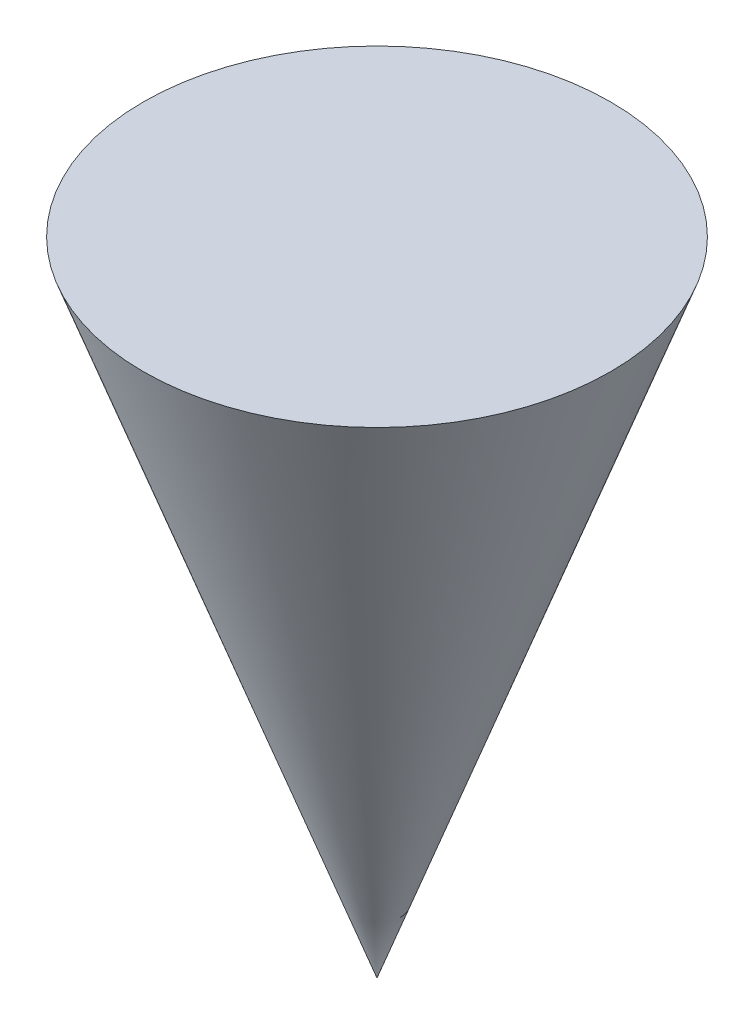
ISO-10303-21;
HEADER;
FILE_DESCRIPTION(('STEP AP214'),'2;1');
FILE_NAME('part.step','',(''),(''),'','','');
FILE_SCHEMA(('AUTOMOTIVE_DESIGN { 1 0 10303 214 1 1 1 1 }'));
ENDSEC;
DATA;
#1=APPLICATION_CONTEXT('core data for automotive mechanical design processes');
#2=APPLICATION_PROTOCOL_DEFINITION('international standard','automotive_design',2000,#1);
#3=PRODUCT_CONTEXT('',#1,'mechanical');
#4=PRODUCT('Part','Part','',(#3));
#5=PRODUCT_RELATED_PRODUCT_CATEGORY('part','',(#4));
#6=PRODUCT_DEFINITION_FORMATION('','',#4);
#7=PRODUCT_DEFINITION_CONTEXT('part definition',#1,'design');
#8=PRODUCT_DEFINITION('design','',#6,#7);
#9=PRODUCT_DEFINITION_SHAPE('','',#8);
#10=(LENGTH_UNIT() NAMED_UNIT(*) SI_UNIT(.MILLI.,.METRE.));
#11=(NAMED_UNIT(*) PLANE_ANGLE_UNIT() SI_UNIT($,.RADIAN.));
#12=(NAMED_UNIT(*) SI_UNIT($,.STERADIAN.) SOLID_ANGLE_UNIT());
#13=UNCERTAINTY_MEASURE_WITH_UNIT(LENGTH_MEASURE(1.E-05),#10,'distance_accuracy_value','');
#14=(GEOMETRIC_REPRESENTATION_CONTEXT(3) GLOBAL_UNCERTAINTY_ASSIGNED_CONTEXT((#13)) GLOBAL_UNIT_ASSIGNED_CONTEXT((#10,
#11,#12)) REPRESENTATION_CONTEXT('',''));
#15=CARTESIAN_POINT('',(0.,0.,0.));
#16=DIRECTION('',(0.,0.,1.));
#17=DIRECTION('',(1.,0.,0.));
#18=AXIS2_PLACEMENT_3D('',#15,#16,#17);
#19=CARTESIAN_POINT('',(0.,0.,0.));
#20=DIRECTION('',(0.,1.,0.));
#21=DIRECTION('',(0.,0.,1.));
#22=AXIS2_PLACEMENT_3D('',#19,#20,#21);
#23=CONICAL_SURFACE('',#22,0.,0.349065850398863);
#24=CARTESIAN_POINT('',(0.,100.,0.));
#25=DIRECTION('',(0.,-1.,0.));
#26=DIRECTION('',(0.,0.,-1.));
#27=AXIS2_PLACEMENT_3D('',#24,#25,#26);
#28=CIRCLE('',#27,36.3970234266199);
#29=CARTESIAN_POINT('',(0.,100.,-36.3970234266199));
#30=VERTEX_POINT('',#29);
#31=EDGE_CURVE('E11',#30,#30,#28,.T.);
#32=ORIENTED_EDGE('',*,*,#31,.T.);
#33=EDGE_LOOP('',(#32));
#34=FACE_BOUND('',#33,.T.);
#35=CARTESIAN_POINT('',(0.,0.,0.));
#36=VERTEX_POINT('',#35);
#37=VERTEX_LOOP('',#36);
#38=FACE_BOUND('',#37,.T.);
#39=ADVANCED_FACE('F37',(#34,#38),#23,.T.);
#40=CARTESIAN_POINT('',(0.,100.,0.));
#41=DIRECTION('',(0.,1.,0.));
#42=DIRECTION('',(0.,0.,1.));
#43=AXIS2_PLACEMENT_3D('',#40,#41,#42);
#44=PLANE('',#43);
#45=ORIENTED_EDGE('',*,*,#31,.F.);
#46=EDGE_LOOP('',(#45));
#47=FACE_BOUND('',#46,.T.);
#48=ADVANCED_FACE('F45',(#47),#44,.T.);
#49=CLOSED_SHELL('',(#39,#48));
#50=MANIFOLD_SOLID_BREP('B2',#49);
#51=ADVANCED_BREP_SHAPE_REPRESENTATION('',(#18,#50),#14);
#52=SHAPE_DEFINITION_REPRESENTATION(#9,#51);
ENDSEC;
END-ISO-10303-21;
